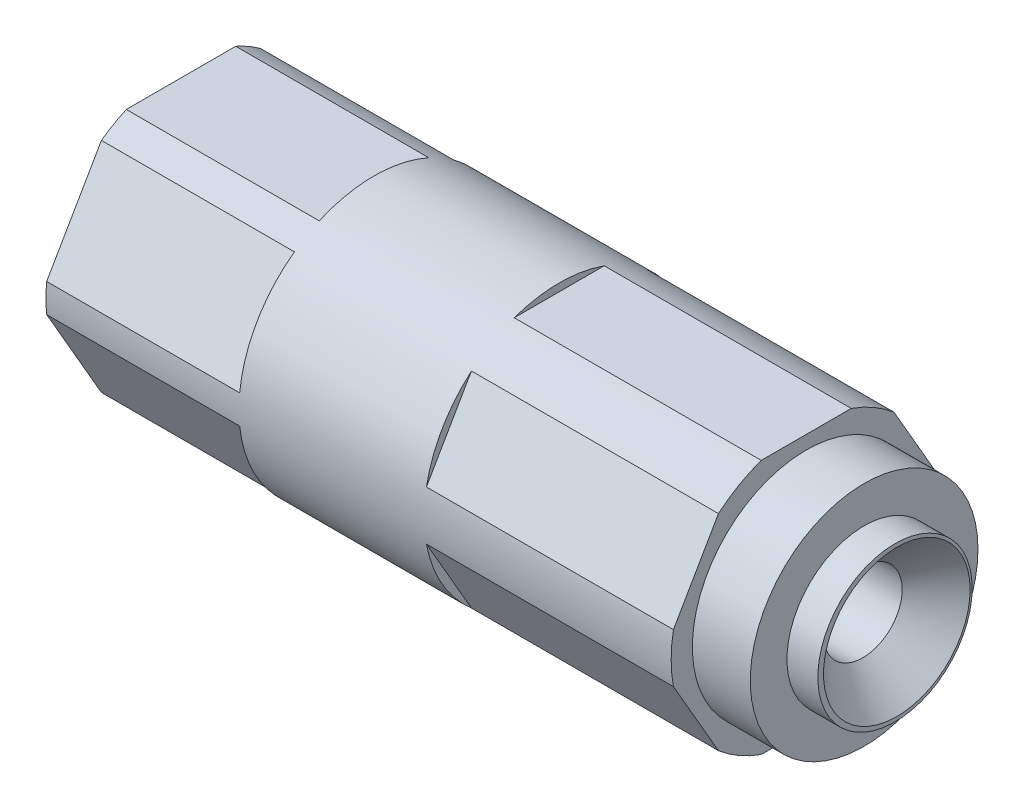
ISO-10303-21;
HEADER;
FILE_DESCRIPTION(('STEP AP214'),'2;1');
FILE_NAME('part.step','',(''),(''),'','','');
FILE_SCHEMA(('AUTOMOTIVE_DESIGN { 1 0 10303 214 1 1 1 1 }'));
ENDSEC;
DATA;
#1=APPLICATION_CONTEXT('core data for automotive mechanical design processes');
#2=APPLICATION_PROTOCOL_DEFINITION('international standard','automotive_design',2000,#1);
#3=PRODUCT_CONTEXT('',#1,'mechanical');
#4=PRODUCT('Part','Part','',(#3));
#5=PRODUCT_RELATED_PRODUCT_CATEGORY('part','',(#4));
#6=PRODUCT_DEFINITION_FORMATION('','',#4);
#7=PRODUCT_DEFINITION_CONTEXT('part definition',#1,'design');
#8=PRODUCT_DEFINITION('design','',#6,#7);
#9=PRODUCT_DEFINITION_SHAPE('','',#8);
#10=(LENGTH_UNIT() NAMED_UNIT(*) SI_UNIT(.MILLI.,.METRE.));
#11=(NAMED_UNIT(*) PLANE_ANGLE_UNIT() SI_UNIT($,.RADIAN.));
#12=(NAMED_UNIT(*) SI_UNIT($,.STERADIAN.) SOLID_ANGLE_UNIT());
#13=UNCERTAINTY_MEASURE_WITH_UNIT(LENGTH_MEASURE(1.E-05),#10,'distance_accuracy_value','');
#14=(GEOMETRIC_REPRESENTATION_CONTEXT(3) GLOBAL_UNCERTAINTY_ASSIGNED_CONTEXT((#13)) GLOBAL_UNIT_ASSIGNED_CONTEXT((#10,
#11,#12)) REPRESENTATION_CONTEXT('',''));
#15=CARTESIAN_POINT('',(0.,0.,0.));
#16=DIRECTION('',(0.,0.,1.));
#17=DIRECTION('',(1.,0.,0.));
#18=AXIS2_PLACEMENT_3D('',#15,#16,#17);
#19=CARTESIAN_POINT('',(0.,0.,0.));
#20=DIRECTION('',(1.,0.,0.));
#21=DIRECTION('',(0.,0.,-1.));
#22=AXIS2_PLACEMENT_3D('',#19,#20,#21);
#23=CYLINDRICAL_SURFACE('',#22,17.5);
#24=CARTESIAN_POINT('',(25.,0.,0.));
#25=DIRECTION('',(-1.,0.,0.));
#26=DIRECTION('',(0.,0.,1.));
#27=AXIS2_PLACEMENT_3D('',#24,#25,#26);
#28=CIRCLE('',#27,17.5);
#29=CARTESIAN_POINT('',(25.,14.1390145789043,10.3120447408616));
#30=VERTEX_POINT('',#29);
#31=CARTESIAN_POINT('',(25.,1.86098542109565,17.4007681802405));
#32=VERTEX_POINT('',#31);
#33=EDGE_CURVE('E337',#30,#32,#28,.F.);
#34=ORIENTED_EDGE('',*,*,#33,.T.);
#35=DIRECTION('',(1.,0.,0.));
#36=VECTOR('',#35,1.);
#37=CARTESIAN_POINT('',(0.,1.86098542109565,17.4007681802405));
#38=LINE('',#37,#36);
#39=CARTESIAN_POINT('',(0.,1.86098542109565,17.4007681802405));
#40=VERTEX_POINT('',#39);
#41=EDGE_CURVE('E371',#32,#40,#38,.F.);
#42=ORIENTED_EDGE('',*,*,#41,.T.);
#43=CARTESIAN_POINT('',(0.,0.,0.));
#44=DIRECTION('',(1.,0.,0.));
#45=DIRECTION('',(0.,0.,-1.));
#46=AXIS2_PLACEMENT_3D('',#43,#44,#45);
#47=CIRCLE('',#46,17.5);
#48=CARTESIAN_POINT('',(0.,-1.86098542109564,17.4007681802405));
#49=VERTEX_POINT('',#48);
#50=EDGE_CURVE('E518',#40,#49,#47,.T.);
#51=ORIENTED_EDGE('',*,*,#50,.T.);
#52=DIRECTION('',(1.,0.,0.));
#53=VECTOR('',#52,1.);
#54=CARTESIAN_POINT('',(0.,-1.86098542109565,17.4007681802405));
#55=LINE('',#54,#53);
#56=CARTESIAN_POINT('',(25.,-1.86098542109565,17.4007681802405));
#57=VERTEX_POINT('',#56);
#58=EDGE_CURVE('E361',#49,#57,#55,.T.);
#59=ORIENTED_EDGE('',*,*,#58,.T.);
#60=CARTESIAN_POINT('',(25.,-14.1390145789044,10.3120447408615));
#61=VERTEX_POINT('',#60);
#62=EDGE_CURVE('E364',#57,#61,#28,.F.);
#63=ORIENTED_EDGE('',*,*,#62,.T.);
#64=DIRECTION('',(1.,0.,0.));
#65=VECTOR('',#64,1.);
#66=CARTESIAN_POINT('',(0.,-14.1390145789044,10.3120447408615));
#67=LINE('',#66,#65);
#68=CARTESIAN_POINT('',(0.,-14.1390145789044,10.3120447408615));
#69=VERTEX_POINT('',#68);
#70=EDGE_CURVE('E365',#61,#69,#67,.F.);
#71=ORIENTED_EDGE('',*,*,#70,.T.);
#72=CARTESIAN_POINT('',(0.,-16.,7.08872343937892));
#73=VERTEX_POINT('',#72);
#74=EDGE_CURVE('E523',#69,#73,#47,.T.);
#75=ORIENTED_EDGE('',*,*,#74,.T.);
#76=DIRECTION('',(1.,0.,0.));
#77=VECTOR('',#76,1.);
#78=CARTESIAN_POINT('',(0.,-16.,7.08872343937892));
#79=LINE('',#78,#77);
#80=CARTESIAN_POINT('',(25.,-16.,7.08872343937892));
#81=VERTEX_POINT('',#80);
#82=EDGE_CURVE('E354',#73,#81,#79,.T.);
#83=ORIENTED_EDGE('',*,*,#82,.T.);
#84=CARTESIAN_POINT('',(25.,-16.,-7.08872343937893));
#85=VERTEX_POINT('',#84);
#86=EDGE_CURVE('E357',#81,#85,#28,.F.);
#87=ORIENTED_EDGE('',*,*,#86,.T.);
#88=DIRECTION('',(1.,0.,0.));
#89=VECTOR('',#88,1.);
#90=CARTESIAN_POINT('',(0.,-16.,-7.08872343937893));
#91=LINE('',#90,#89);
#92=CARTESIAN_POINT('',(0.,-16.,-7.08872343937893));
#93=VERTEX_POINT('',#92);
#94=EDGE_CURVE('E358',#85,#93,#91,.F.);
#95=ORIENTED_EDGE('',*,*,#94,.T.);
#96=CARTESIAN_POINT('',(0.,-14.1390145789043,-10.3120447408616));
#97=VERTEX_POINT('',#96);
#98=EDGE_CURVE('E328',#93,#97,#47,.T.);
#99=ORIENTED_EDGE('',*,*,#98,.T.);
#100=DIRECTION('',(1.,0.,0.));
#101=VECTOR('',#100,1.);
#102=CARTESIAN_POINT('',(0.,-14.1390145789043,-10.3120447408616));
#103=LINE('',#102,#101);
#104=CARTESIAN_POINT('',(25.,-14.1390145789043,-10.3120447408616));
#105=VERTEX_POINT('',#104);
#106=EDGE_CURVE('E347',#97,#105,#103,.T.);
#107=ORIENTED_EDGE('',*,*,#106,.T.);
#108=CARTESIAN_POINT('',(25.,-1.86098542109567,-17.4007681802405));
#109=VERTEX_POINT('',#108);
#110=EDGE_CURVE('E350',#105,#109,#28,.F.);
#111=ORIENTED_EDGE('',*,*,#110,.T.);
#112=DIRECTION('',(1.,0.,0.));
#113=VECTOR('',#112,1.);
#114=CARTESIAN_POINT('',(0.,-1.86098542109567,-17.4007681802405));
#115=LINE('',#114,#113);
#116=CARTESIAN_POINT('',(0.,-1.86098542109567,-17.4007681802405));
#117=VERTEX_POINT('',#116);
#118=EDGE_CURVE('E351',#109,#117,#115,.F.);
#119=ORIENTED_EDGE('',*,*,#118,.T.);
#120=CARTESIAN_POINT('',(0.,1.86098542109566,-17.4007681802405));
#121=VERTEX_POINT('',#120);
#122=EDGE_CURVE('E325',#117,#121,#47,.T.);
#123=ORIENTED_EDGE('',*,*,#122,.T.);
#124=DIRECTION('',(1.,0.,0.));
#125=VECTOR('',#124,1.);
#126=CARTESIAN_POINT('',(0.,1.86098542109566,-17.4007681802405));
#127=LINE('',#126,#125);
#128=CARTESIAN_POINT('',(25.,1.86098542109566,-17.4007681802405));
#129=VERTEX_POINT('',#128);
#130=EDGE_CURVE('E341',#121,#129,#127,.T.);
#131=ORIENTED_EDGE('',*,*,#130,.T.);
#132=CARTESIAN_POINT('',(25.,14.1390145789043,-10.3120447408616));
#133=VERTEX_POINT('',#132);
#134=EDGE_CURVE('E338',#129,#133,#28,.F.);
#135=ORIENTED_EDGE('',*,*,#134,.T.);
#136=DIRECTION('',(1.,0.,0.));
#137=VECTOR('',#136,1.);
#138=CARTESIAN_POINT('',(0.,14.1390145789043,-10.3120447408616));
#139=LINE('',#138,#137);
#140=CARTESIAN_POINT('',(0.,14.1390145789043,-10.3120447408616));
#141=VERTEX_POINT('',#140);
#142=EDGE_CURVE('E344',#133,#141,#139,.F.);
#143=ORIENTED_EDGE('',*,*,#142,.T.);
#144=CARTESIAN_POINT('',(0.,16.,-7.08872343937891));
#145=VERTEX_POINT('',#144);
#146=EDGE_CURVE('E329',#141,#145,#47,.T.);
#147=ORIENTED_EDGE('',*,*,#146,.T.);
#148=DIRECTION('',(1.,0.,0.));
#149=VECTOR('',#148,1.);
#150=CARTESIAN_POINT('',(0.,16.,-7.08872343937891));
#151=LINE('',#150,#149);
#152=CARTESIAN_POINT('',(25.,16.,-7.08872343937891));
#153=VERTEX_POINT('',#152);
#154=EDGE_CURVE('E330',#145,#153,#151,.T.);
#155=ORIENTED_EDGE('',*,*,#154,.T.);
#156=CARTESIAN_POINT('',(25.,16.,7.08872343937891));
#157=VERTEX_POINT('',#156);
#158=EDGE_CURVE('E333',#153,#157,#28,.F.);
#159=ORIENTED_EDGE('',*,*,#158,.T.);
#160=DIRECTION('',(1.,0.,0.));
#161=VECTOR('',#160,1.);
#162=CARTESIAN_POINT('',(0.,16.,7.08872343937891));
#163=LINE('',#162,#161);
#164=CARTESIAN_POINT('',(0.,16.,7.08872343937891));
#165=VERTEX_POINT('',#164);
#166=EDGE_CURVE('E336',#157,#165,#163,.F.);
#167=ORIENTED_EDGE('',*,*,#166,.T.);
#168=CARTESIAN_POINT('',(0.,14.1390145789043,10.3120447408616));
#169=VERTEX_POINT('',#168);
#170=EDGE_CURVE('E522',#165,#169,#47,.T.);
#171=ORIENTED_EDGE('',*,*,#170,.T.);
#172=DIRECTION('',(1.,0.,0.));
#173=VECTOR('',#172,1.);
#174=CARTESIAN_POINT('',(0.,14.1390145789043,10.3120447408616));
#175=LINE('',#174,#173);
#176=EDGE_CURVE('E368',#169,#30,#175,.T.);
#177=ORIENTED_EDGE('',*,*,#176,.T.);
#178=EDGE_LOOP('',(#34,#42,#51,#59,#63,#71,#75,#83,#87,#95,#99,#107,#111,#119,#123,#131,#135,
#143,#147,#155,#159,#167,#171,#177));
#179=FACE_BOUND('',#178,.T.);
#180=CARTESIAN_POINT('',(81.,0.,0.));
#181=DIRECTION('',(1.,0.,0.));
#182=DIRECTION('',(0.,0.,-1.));
#183=AXIS2_PLACEMENT_3D('',#180,#181,#182);
#184=CIRCLE('',#183,17.5);
#185=CARTESIAN_POINT('',(81.,-13.299752469181,11.3739432150206));
#186=VERTEX_POINT('',#185);
#187=CARTESIAN_POINT('',(81.,-16.5,5.8309518948453));
#188=VERTEX_POINT('',#187);
#189=EDGE_CURVE('E412',#186,#188,#184,.T.);
#190=ORIENTED_EDGE('',*,*,#189,.F.);
#191=DIRECTION('',(1.,0.,0.));
#192=VECTOR('',#191,1.);
#193=CARTESIAN_POINT('',(0.,-13.299752469181,11.3739432150206));
#194=LINE('',#193,#192);
#195=CARTESIAN_POINT('',(49.,-13.299752469181,11.3739432150206));
#196=VERTEX_POINT('',#195);
#197=EDGE_CURVE('E269',#186,#196,#194,.F.);
#198=ORIENTED_EDGE('',*,*,#197,.T.);
#199=CARTESIAN_POINT('',(49.,0.,0.));
#200=DIRECTION('',(1.,0.,0.));
#201=DIRECTION('',(0.,0.,-1.));
#202=AXIS2_PLACEMENT_3D('',#199,#200,#201);
#203=CIRCLE('',#202,17.5);
#204=CARTESIAN_POINT('',(49.,-3.20024753081897,17.2048951098659));
#205=VERTEX_POINT('',#204);
#206=EDGE_CURVE('E12',#196,#205,#203,.F.);
#207=ORIENTED_EDGE('',*,*,#206,.T.);
#208=DIRECTION('',(1.,0.,0.));
#209=VECTOR('',#208,1.);
#210=CARTESIAN_POINT('',(0.,-3.20024753081897,17.2048951098659));
#211=LINE('',#210,#209);
#212=CARTESIAN_POINT('',(81.,-3.20024753081895,17.2048951098659));
#213=VERTEX_POINT('',#212);
#214=EDGE_CURVE('E266',#205,#213,#211,.T.);
#215=ORIENTED_EDGE('',*,*,#214,.T.);
#216=CARTESIAN_POINT('',(81.,3.20024753081898,17.2048951098659));
#217=VERTEX_POINT('',#216);
#218=EDGE_CURVE('E410',#217,#213,#184,.T.);
#219=ORIENTED_EDGE('',*,*,#218,.F.);
#220=DIRECTION('',(1.,0.,0.));
#221=VECTOR('',#220,1.);
#222=CARTESIAN_POINT('',(0.,3.20024753081897,17.2048951098659));
#223=LINE('',#222,#221);
#224=CARTESIAN_POINT('',(49.,3.20024753081898,17.2048951098659));
#225=VERTEX_POINT('',#224);
#226=EDGE_CURVE('E263',#217,#225,#223,.F.);
#227=ORIENTED_EDGE('',*,*,#226,.T.);
#228=CARTESIAN_POINT('',(49.,13.299752469181,11.3739432150206));
#229=VERTEX_POINT('',#228);
#230=EDGE_CURVE('E48',#225,#229,#203,.F.);
#231=ORIENTED_EDGE('',*,*,#230,.T.);
#232=DIRECTION('',(1.,0.,0.));
#233=VECTOR('',#232,1.);
#234=CARTESIAN_POINT('',(0.,13.299752469181,11.3739432150206));
#235=LINE('',#234,#233);
#236=CARTESIAN_POINT('',(81.,13.299752469181,11.3739432150206));
#237=VERTEX_POINT('',#236);
#238=EDGE_CURVE('E260',#229,#237,#235,.T.);
#239=ORIENTED_EDGE('',*,*,#238,.T.);
#240=CARTESIAN_POINT('',(81.,16.5,5.8309518948453));
#241=VERTEX_POINT('',#240);
#242=EDGE_CURVE('E411',#241,#237,#184,.T.);
#243=ORIENTED_EDGE('',*,*,#242,.F.);
#244=DIRECTION('',(1.,0.,0.));
#245=VECTOR('',#244,1.);
#246=CARTESIAN_POINT('',(0.,16.5,5.83095189484529));
#247=LINE('',#246,#245);
#248=CARTESIAN_POINT('',(49.,16.5,5.83095189484529));
#249=VERTEX_POINT('',#248);
#250=EDGE_CURVE('E257',#241,#249,#247,.F.);
#251=ORIENTED_EDGE('',*,*,#250,.T.);
#252=CARTESIAN_POINT('',(49.,16.5,-5.8309518948453));
#253=VERTEX_POINT('',#252);
#254=EDGE_CURVE('E398',#249,#253,#203,.F.);
#255=ORIENTED_EDGE('',*,*,#254,.T.);
#256=DIRECTION('',(1.,0.,0.));
#257=VECTOR('',#256,1.);
#258=CARTESIAN_POINT('',(0.,16.5,-5.8309518948453));
#259=LINE('',#258,#257);
#260=CARTESIAN_POINT('',(81.,16.5,-5.8309518948453));
#261=VERTEX_POINT('',#260);
#262=EDGE_CURVE('E254',#253,#261,#259,.T.);
#263=ORIENTED_EDGE('',*,*,#262,.T.);
#264=CARTESIAN_POINT('',(81.,13.299752469181,-11.3739432150206));
#265=VERTEX_POINT('',#264);
#266=EDGE_CURVE('E324',#265,#261,#184,.T.);
#267=ORIENTED_EDGE('',*,*,#266,.F.);
#268=DIRECTION('',(1.,0.,0.));
#269=VECTOR('',#268,1.);
#270=CARTESIAN_POINT('',(0.,13.299752469181,-11.3739432150206));
#271=LINE('',#270,#269);
#272=CARTESIAN_POINT('',(49.,13.299752469181,-11.3739432150206));
#273=VERTEX_POINT('',#272);
#274=EDGE_CURVE('E251',#265,#273,#271,.F.);
#275=ORIENTED_EDGE('',*,*,#274,.T.);
#276=CARTESIAN_POINT('',(49.,3.20024753081896,-17.2048951098659));
#277=VERTEX_POINT('',#276);
#278=EDGE_CURVE('E396',#273,#277,#203,.F.);
#279=ORIENTED_EDGE('',*,*,#278,.T.);
#280=DIRECTION('',(1.,0.,0.));
#281=VECTOR('',#280,1.);
#282=CARTESIAN_POINT('',(0.,3.20024753081896,-17.2048951098659));
#283=LINE('',#282,#281);
#284=CARTESIAN_POINT('',(81.,3.20024753081896,-17.2048951098659));
#285=VERTEX_POINT('',#284);
#286=EDGE_CURVE('E248',#277,#285,#283,.T.);
#287=ORIENTED_EDGE('',*,*,#286,.T.);
#288=CARTESIAN_POINT('',(81.,-3.20024753081898,-17.2048951098659));
#289=VERTEX_POINT('',#288);
#290=EDGE_CURVE('E320',#289,#285,#184,.T.);
#291=ORIENTED_EDGE('',*,*,#290,.F.);
#292=DIRECTION('',(1.,0.,0.));
#293=VECTOR('',#292,1.);
#294=CARTESIAN_POINT('',(0.,-3.20024753081896,-17.2048951098659));
#295=LINE('',#294,#293);
#296=CARTESIAN_POINT('',(49.,-3.20024753081896,-17.2048951098659));
#297=VERTEX_POINT('',#296);
#298=EDGE_CURVE('E55',#289,#297,#295,.F.);
#299=ORIENTED_EDGE('',*,*,#298,.T.);
#300=CARTESIAN_POINT('',(49.,-13.299752469181,-11.3739432150206));
#301=VERTEX_POINT('',#300);
#302=EDGE_CURVE('E393',#297,#301,#203,.F.);
#303=ORIENTED_EDGE('',*,*,#302,.T.);
#304=DIRECTION('',(1.,0.,0.));
#305=VECTOR('',#304,1.);
#306=CARTESIAN_POINT('',(0.,-13.299752469181,-11.3739432150206));
#307=LINE('',#306,#305);
#308=CARTESIAN_POINT('',(81.,-13.299752469181,-11.3739432150206));
#309=VERTEX_POINT('',#308);
#310=EDGE_CURVE('E244',#301,#309,#307,.T.);
#311=ORIENTED_EDGE('',*,*,#310,.T.);
#312=CARTESIAN_POINT('',(81.,-16.5,-5.8309518948453));
#313=VERTEX_POINT('',#312);
#314=EDGE_CURVE('E323',#313,#309,#184,.T.);
#315=ORIENTED_EDGE('',*,*,#314,.F.);
#316=DIRECTION('',(1.,0.,0.));
#317=VECTOR('',#316,1.);
#318=CARTESIAN_POINT('',(0.,-16.5,-5.83095189484531));
#319=LINE('',#318,#317);
#320=CARTESIAN_POINT('',(49.,-16.5,-5.83095189484531));
#321=VERTEX_POINT('',#320);
#322=EDGE_CURVE('E63',#313,#321,#319,.F.);
#323=ORIENTED_EDGE('',*,*,#322,.T.);
#324=CARTESIAN_POINT('',(49.,-16.5,5.83095189484531));
#325=VERTEX_POINT('',#324);
#326=EDGE_CURVE('E43',#321,#325,#203,.F.);
#327=ORIENTED_EDGE('',*,*,#326,.T.);
#328=DIRECTION('',(1.,0.,0.));
#329=VECTOR('',#328,1.);
#330=CARTESIAN_POINT('',(0.,-16.5,5.83095189484531));
#331=LINE('',#330,#329);
#332=EDGE_CURVE('E240',#325,#188,#331,.T.);
#333=ORIENTED_EDGE('',*,*,#332,.T.);
#334=EDGE_LOOP('',(#190,#198,#207,#215,#219,#227,#231,#239,#243,#251,#255,#263,#267,#275,#279,
#287,#291,#299,#303,#311,#315,#323,#327,#333));
#335=FACE_BOUND('',#334,.T.);
#336=ADVANCED_FACE('F39',(#179,#335),#23,.T.);
#337=CARTESIAN_POINT('',(81.,17.5,0.));
#338=DIRECTION('',(1.,0.,0.));
#339=DIRECTION('',(0.,0.,-1.));
#340=AXIS2_PLACEMENT_3D('',#337,#338,#339);
#341=PLANE('',#340);
#342=CARTESIAN_POINT('',(81.,0.,0.));
#343=DIRECTION('',(1.,0.,0.));
#344=DIRECTION('',(0.,0.,-1.));
#345=AXIS2_PLACEMENT_3D('',#342,#343,#344);
#346=CIRCLE('',#345,14.75);
#347=CARTESIAN_POINT('',(81.,0.,-14.75));
#348=VERTEX_POINT('',#347);
#349=EDGE_CURVE('E317',#348,#348,#346,.T.);
#350=ORIENTED_EDGE('',*,*,#349,.F.);
#351=EDGE_LOOP('',(#350));
#352=FACE_BOUND('',#351,.T.);
#353=ORIENTED_EDGE('',*,*,#218,.T.);
#354=DIRECTION('',(0.,-0.866025403784439,-0.5));
#355=VECTOR('',#354,1.);
#356=CARTESIAN_POINT('',(81.,4.87500000000001,21.8671414455571));
#357=LINE('',#356,#355);
#358=EDGE_CURVE('E386',#213,#186,#357,.T.);
#359=ORIENTED_EDGE('',*,*,#358,.T.);
#360=ORIENTED_EDGE('',*,*,#189,.T.);
#361=DIRECTION('',(0.,0.,-1.));
#362=VECTOR('',#361,1.);
#363=CARTESIAN_POINT('',(81.,-16.5,0.));
#364=LINE('',#363,#362);
#365=EDGE_CURVE('E374',#188,#313,#364,.T.);
#366=ORIENTED_EDGE('',*,*,#365,.T.);
#367=ORIENTED_EDGE('',*,*,#314,.T.);
#368=DIRECTION('',(0.,0.866025403784439,-0.5));
#369=VECTOR('',#368,1.);
#370=CARTESIAN_POINT('',(81.,4.875,-21.8671414455571));
#371=LINE('',#370,#369);
#372=EDGE_CURVE('E376',#309,#289,#371,.T.);
#373=ORIENTED_EDGE('',*,*,#372,.T.);
#374=ORIENTED_EDGE('',*,*,#290,.T.);
#375=DIRECTION('',(0.,0.866025403784439,0.5));
#376=VECTOR('',#375,1.);
#377=CARTESIAN_POINT('',(81.,21.375,-6.71169687932941));
#378=LINE('',#377,#376);
#379=EDGE_CURVE('E378',#285,#265,#378,.T.);
#380=ORIENTED_EDGE('',*,*,#379,.T.);
#381=ORIENTED_EDGE('',*,*,#266,.T.);
#382=DIRECTION('',(0.,0.,1.));
#383=VECTOR('',#382,1.);
#384=CARTESIAN_POINT('',(81.,16.5,0.));
#385=LINE('',#384,#383);
#386=EDGE_CURVE('E381',#261,#241,#385,.T.);
#387=ORIENTED_EDGE('',*,*,#386,.T.);
#388=ORIENTED_EDGE('',*,*,#242,.T.);
#389=DIRECTION('',(0.,-0.866025403784439,0.5));
#390=VECTOR('',#389,1.);
#391=CARTESIAN_POINT('',(81.,21.375,6.7116968793294));
#392=LINE('',#391,#390);
#393=EDGE_CURVE('E384',#237,#217,#392,.T.);
#394=ORIENTED_EDGE('',*,*,#393,.T.);
#395=EDGE_LOOP('',(#353,#359,#360,#366,#367,#373,#374,#380,#381,#387,#388,#394));
#396=FACE_BOUND('',#395,.T.);
#397=ADVANCED_FACE('F409',(#352,#396),#341,.T.);
#398=CARTESIAN_POINT('',(0.,0.,0.));
#399=DIRECTION('',(-1.,0.,0.));
#400=DIRECTION('',(0.,0.,1.));
#401=AXIS2_PLACEMENT_3D('',#398,#399,#400);
#402=PLANE('',#401);
#403=CARTESIAN_POINT('',(0.,0.,0.));
#404=DIRECTION('',(-1.,0.,0.));
#405=DIRECTION('',(0.,0.,1.));
#406=AXIS2_PLACEMENT_3D('',#403,#404,#405);
#407=CIRCLE('',#406,4.25);
#408=CARTESIAN_POINT('',(0.,0.,4.25));
#409=VERTEX_POINT('',#408);
#410=EDGE_CURVE('E272',#409,#409,#407,.T.);
#411=ORIENTED_EDGE('',*,*,#410,.F.);
#412=EDGE_LOOP('',(#411));
#413=FACE_BOUND('',#412,.T.);
#414=ORIENTED_EDGE('',*,*,#50,.F.);
#415=DIRECTION('',(0.,0.866025403784439,-0.5));
#416=VECTOR('',#415,1.);
#417=CARTESIAN_POINT('',(0.,0.,18.475208614068));
#418=LINE('',#417,#416);
#419=EDGE_CURVE('E278',#40,#169,#418,.T.);
#420=ORIENTED_EDGE('',*,*,#419,.T.);
#421=ORIENTED_EDGE('',*,*,#170,.F.);
#422=DIRECTION('',(0.,0.,-1.));
#423=VECTOR('',#422,1.);
#424=CARTESIAN_POINT('',(0.,16.,9.23760430703401));
#425=LINE('',#424,#423);
#426=EDGE_CURVE('E295',#165,#145,#425,.T.);
#427=ORIENTED_EDGE('',*,*,#426,.T.);
#428=ORIENTED_EDGE('',*,*,#146,.F.);
#429=DIRECTION('',(0.,-0.866025403784439,-0.5));
#430=VECTOR('',#429,1.);
#431=CARTESIAN_POINT('',(0.,16.,-9.23760430703401));
#432=LINE('',#431,#430);
#433=EDGE_CURVE('E298',#141,#121,#432,.T.);
#434=ORIENTED_EDGE('',*,*,#433,.T.);
#435=ORIENTED_EDGE('',*,*,#122,.F.);
#436=DIRECTION('',(0.,-0.866025403784439,0.5));
#437=VECTOR('',#436,1.);
#438=CARTESIAN_POINT('',(0.,0.,-18.475208614068));
#439=LINE('',#438,#437);
#440=EDGE_CURVE('E301',#117,#97,#439,.T.);
#441=ORIENTED_EDGE('',*,*,#440,.T.);
#442=ORIENTED_EDGE('',*,*,#98,.F.);
#443=DIRECTION('',(0.,0.,1.));
#444=VECTOR('',#443,1.);
#445=CARTESIAN_POINT('',(0.,-16.,-9.23760430703402));
#446=LINE('',#445,#444);
#447=EDGE_CURVE('E304',#93,#73,#446,.T.);
#448=ORIENTED_EDGE('',*,*,#447,.T.);
#449=ORIENTED_EDGE('',*,*,#74,.F.);
#450=DIRECTION('',(0.,0.866025403784439,0.5));
#451=VECTOR('',#450,1.);
#452=CARTESIAN_POINT('',(0.,-16.,9.237604307034));
#453=LINE('',#452,#451);
#454=EDGE_CURVE('E282',#69,#49,#453,.T.);
#455=ORIENTED_EDGE('',*,*,#454,.T.);
#456=EDGE_LOOP('',(#414,#420,#421,#427,#428,#434,#435,#441,#442,#448,#449,#455));
#457=FACE_BOUND('',#456,.T.);
#458=ADVANCED_FACE('F41',(#413,#457),#402,.T.);
#459=CARTESIAN_POINT('',(0.,0.,0.));
#460=DIRECTION('',(1.,0.,0.));
#461=DIRECTION('',(0.,0.,-1.));
#462=AXIS2_PLACEMENT_3D('',#459,#460,#461);
#463=CYLINDRICAL_SURFACE('',#462,14.75);
#464=ORIENTED_EDGE('',*,*,#349,.T.);
#465=EDGE_LOOP('',(#464));
#466=FACE_BOUND('',#465,.T.);
#467=CARTESIAN_POINT('',(88.5,0.,0.));
#468=DIRECTION('',(1.,0.,0.));
#469=DIRECTION('',(0.,0.,-1.));
#470=AXIS2_PLACEMENT_3D('',#467,#468,#469);
#471=CIRCLE('',#470,14.75);
#472=CARTESIAN_POINT('',(88.5,0.,-14.75));
#473=VERTEX_POINT('',#472);
#474=EDGE_CURVE('E314',#473,#473,#471,.T.);
#475=ORIENTED_EDGE('',*,*,#474,.F.);
#476=EDGE_LOOP('',(#475));
#477=FACE_BOUND('',#476,.T.);
#478=ADVANCED_FACE('F451',(#466,#477),#463,.T.);
#479=CARTESIAN_POINT('',(88.5,14.75,0.));
#480=DIRECTION('',(1.,0.,0.));
#481=DIRECTION('',(0.,0.,-1.));
#482=AXIS2_PLACEMENT_3D('',#479,#480,#481);
#483=PLANE('',#482);
#484=ORIENTED_EDGE('',*,*,#474,.T.);
#485=EDGE_LOOP('',(#484));
#486=FACE_BOUND('',#485,.T.);
#487=CARTESIAN_POINT('',(88.5,0.,0.));
#488=DIRECTION('',(1.,0.,0.));
#489=DIRECTION('',(0.,0.,-1.));
#490=AXIS2_PLACEMENT_3D('',#487,#488,#489);
#491=CIRCLE('',#490,10.);
#492=CARTESIAN_POINT('',(88.5,0.,-10.));
#493=VERTEX_POINT('',#492);
#494=EDGE_CURVE('E311',#493,#493,#491,.T.);
#495=ORIENTED_EDGE('',*,*,#494,.F.);
#496=EDGE_LOOP('',(#495));
#497=FACE_BOUND('',#496,.T.);
#498=ADVANCED_FACE('F454',(#486,#497),#483,.T.);
#499=CARTESIAN_POINT('',(0.,0.,0.));
#500=DIRECTION('',(1.,0.,0.));
#501=DIRECTION('',(0.,0.,-1.));
#502=AXIS2_PLACEMENT_3D('',#499,#500,#501);
#503=CYLINDRICAL_SURFACE('',#502,10.);
#504=ORIENTED_EDGE('',*,*,#494,.T.);
#505=EDGE_LOOP('',(#504));
#506=FACE_BOUND('',#505,.T.);
#507=CARTESIAN_POINT('',(92.5,0.,0.));
#508=DIRECTION('',(1.,0.,0.));
#509=DIRECTION('',(0.,0.,-1.));
#510=AXIS2_PLACEMENT_3D('',#507,#508,#509);
#511=CIRCLE('',#510,10.);
#512=CARTESIAN_POINT('',(92.5,0.,-10.));
#513=VERTEX_POINT('',#512);
#514=EDGE_CURVE('E292',#513,#513,#511,.T.);
#515=ORIENTED_EDGE('',*,*,#514,.F.);
#516=EDGE_LOOP('',(#515));
#517=FACE_BOUND('',#516,.T.);
#518=ADVANCED_FACE('F458',(#506,#517),#503,.T.);
#519=CARTESIAN_POINT('',(92.5,10.,0.));
#520=DIRECTION('',(1.,0.,0.));
#521=DIRECTION('',(0.,0.,-1.));
#522=AXIS2_PLACEMENT_3D('',#519,#520,#521);
#523=PLANE('',#522);
#524=CARTESIAN_POINT('',(92.5,-0.0250363622740224,-0.231792894879845));
#525=DIRECTION('',(1.,0.,0.));
#526=DIRECTION('',(0.,0.,-1.));
#527=AXIS2_PLACEMENT_3D('',#524,#525,#526);
#528=CIRCLE('',#527,9.5);
#529=CARTESIAN_POINT('',(92.5,-0.0250363622740224,-9.73179289487985));
#530=VERTEX_POINT('',#529);
#531=EDGE_CURVE('E224',#530,#530,#528,.T.);
#532=ORIENTED_EDGE('',*,*,#531,.F.);
#533=EDGE_LOOP('',(#532));
#534=FACE_BOUND('',#533,.T.);
#535=ORIENTED_EDGE('',*,*,#514,.T.);
#536=EDGE_LOOP('',(#535));
#537=FACE_BOUND('',#536,.T.);
#538=ADVANCED_FACE('F462',(#534,#537),#523,.T.);
#539=CARTESIAN_POINT('',(25.,16.,9.23760430703401));
#540=DIRECTION('',(0.,1.,0.));
#541=DIRECTION('',(0.,0.,1.));
#542=AXIS2_PLACEMENT_3D('',#539,#540,#541);
#543=PLANE('',#542);
#544=DIRECTION('',(0.,0.,-1.));
#545=VECTOR('',#544,1.);
#546=CARTESIAN_POINT('',(25.,16.,9.23760430703401));
#547=LINE('',#546,#545);
#548=EDGE_CURVE('E281',#157,#153,#547,.T.);
#549=ORIENTED_EDGE('',*,*,#548,.T.);
#550=ORIENTED_EDGE('',*,*,#154,.F.);
#551=ORIENTED_EDGE('',*,*,#426,.F.);
#552=ORIENTED_EDGE('',*,*,#166,.F.);
#553=EDGE_LOOP('',(#549,#550,#551,#552));
#554=FACE_BOUND('',#553,.T.);
#555=ADVANCED_FACE('F466',(#554),#543,.T.);
#556=CARTESIAN_POINT('',(25.,0.,0.));
#557=DIRECTION('',(-1.,0.,0.));
#558=DIRECTION('',(0.,0.,1.));
#559=AXIS2_PLACEMENT_3D('',#556,#557,#558);
#560=PLANE('',#559);
#561=ORIENTED_EDGE('',*,*,#548,.F.);
#562=ORIENTED_EDGE('',*,*,#158,.F.);
#563=EDGE_LOOP('',(#561,#562));
#564=FACE_BOUND('',#563,.T.);
#565=ADVANCED_FACE('F474',(#564),#560,.T.);
#566=CARTESIAN_POINT('',(25.,16.,-9.23760430703401));
#567=DIRECTION('',(0.,0.5,-0.866025403784439));
#568=DIRECTION('',(0.,0.866025403784439,0.5));
#569=AXIS2_PLACEMENT_3D('',#566,#567,#568);
#570=PLANE('',#569);
#571=DIRECTION('',(0.,-0.866025403784439,-0.5));
#572=VECTOR('',#571,1.);
#573=CARTESIAN_POINT('',(25.,16.,-9.23760430703401));
#574=LINE('',#573,#572);
#575=EDGE_CURVE('E284',#133,#129,#574,.T.);
#576=ORIENTED_EDGE('',*,*,#575,.T.);
#577=ORIENTED_EDGE('',*,*,#130,.F.);
#578=ORIENTED_EDGE('',*,*,#433,.F.);
#579=ORIENTED_EDGE('',*,*,#142,.F.);
#580=EDGE_LOOP('',(#576,#577,#578,#579));
#581=FACE_BOUND('',#580,.T.);
#582=ADVANCED_FACE('F482',(#581),#570,.T.);
#583=ORIENTED_EDGE('',*,*,#575,.F.);
#584=ORIENTED_EDGE('',*,*,#134,.F.);
#585=EDGE_LOOP('',(#583,#584));
#586=FACE_BOUND('',#585,.T.);
#587=ADVANCED_FACE('F485',(#586),#560,.T.);
#588=CARTESIAN_POINT('',(25.,0.,-18.475208614068));
#589=DIRECTION('',(0.,-0.5,-0.866025403784439));
#590=DIRECTION('',(0.,0.866025403784439,-0.5));
#591=AXIS2_PLACEMENT_3D('',#588,#589,#590);
#592=PLANE('',#591);
#593=DIRECTION('',(0.,-0.866025403784439,0.5));
#594=VECTOR('',#593,1.);
#595=CARTESIAN_POINT('',(25.,0.,-18.475208614068));
#596=LINE('',#595,#594);
#597=EDGE_CURVE('E286',#109,#105,#596,.T.);
#598=ORIENTED_EDGE('',*,*,#597,.T.);
#599=ORIENTED_EDGE('',*,*,#106,.F.);
#600=ORIENTED_EDGE('',*,*,#440,.F.);
#601=ORIENTED_EDGE('',*,*,#118,.F.);
#602=EDGE_LOOP('',(#598,#599,#600,#601));
#603=FACE_BOUND('',#602,.T.);
#604=ADVANCED_FACE('F487',(#603),#592,.T.);
#605=ORIENTED_EDGE('',*,*,#597,.F.);
#606=ORIENTED_EDGE('',*,*,#110,.F.);
#607=EDGE_LOOP('',(#605,#606));
#608=FACE_BOUND('',#607,.T.);
#609=ADVANCED_FACE('F490',(#608),#560,.T.);
#610=CARTESIAN_POINT('',(25.,-16.,-9.23760430703402));
#611=DIRECTION('',(0.,-1.,0.));
#612=DIRECTION('',(0.,0.,-1.));
#613=AXIS2_PLACEMENT_3D('',#610,#611,#612);
#614=PLANE('',#613);
#615=DIRECTION('',(0.,0.,1.));
#616=VECTOR('',#615,1.);
#617=CARTESIAN_POINT('',(25.,-16.,-9.23760430703402));
#618=LINE('',#617,#616);
#619=EDGE_CURVE('E288',#85,#81,#618,.T.);
#620=ORIENTED_EDGE('',*,*,#619,.T.);
#621=ORIENTED_EDGE('',*,*,#82,.F.);
#622=ORIENTED_EDGE('',*,*,#447,.F.);
#623=ORIENTED_EDGE('',*,*,#94,.F.);
#624=EDGE_LOOP('',(#620,#621,#622,#623));
#625=FACE_BOUND('',#624,.T.);
#626=ADVANCED_FACE('F492',(#625),#614,.T.);
#627=ORIENTED_EDGE('',*,*,#619,.F.);
#628=ORIENTED_EDGE('',*,*,#86,.F.);
#629=EDGE_LOOP('',(#627,#628));
#630=FACE_BOUND('',#629,.T.);
#631=ADVANCED_FACE('F495',(#630),#560,.T.);
#632=CARTESIAN_POINT('',(25.,-16.,9.237604307034));
#633=DIRECTION('',(0.,-0.5,0.866025403784438));
#634=DIRECTION('',(0.,-0.866025403784438,-0.5));
#635=AXIS2_PLACEMENT_3D('',#632,#633,#634);
#636=PLANE('',#635);
#637=DIRECTION('',(0.,0.866025403784439,0.5));
#638=VECTOR('',#637,1.);
#639=CARTESIAN_POINT('',(25.,-16.,9.237604307034));
#640=LINE('',#639,#638);
#641=EDGE_CURVE('E290',#61,#57,#640,.T.);
#642=ORIENTED_EDGE('',*,*,#641,.T.);
#643=ORIENTED_EDGE('',*,*,#58,.F.);
#644=ORIENTED_EDGE('',*,*,#454,.F.);
#645=ORIENTED_EDGE('',*,*,#70,.F.);
#646=EDGE_LOOP('',(#642,#643,#644,#645));
#647=FACE_BOUND('',#646,.T.);
#648=ADVANCED_FACE('F497',(#647),#636,.T.);
#649=ORIENTED_EDGE('',*,*,#641,.F.);
#650=ORIENTED_EDGE('',*,*,#62,.F.);
#651=EDGE_LOOP('',(#649,#650));
#652=FACE_BOUND('',#651,.T.);
#653=ADVANCED_FACE('F472',(#652),#560,.T.);
#654=DIRECTION('',(0.,0.866025403784439,-0.5));
#655=VECTOR('',#654,1.);
#656=CARTESIAN_POINT('',(25.,0.,18.475208614068));
#657=LINE('',#656,#655);
#658=EDGE_CURVE('E279',#32,#30,#657,.T.);
#659=ORIENTED_EDGE('',*,*,#658,.F.);
#660=ORIENTED_EDGE('',*,*,#33,.F.);
#661=EDGE_LOOP('',(#659,#660));
#662=FACE_BOUND('',#661,.T.);
#663=ADVANCED_FACE('F468',(#662),#560,.T.);
#664=CARTESIAN_POINT('',(25.,0.,18.475208614068));
#665=DIRECTION('',(0.,0.5,0.866025403784439));
#666=DIRECTION('',(0.,-0.866025403784439,0.5));
#667=AXIS2_PLACEMENT_3D('',#664,#665,#666);
#668=PLANE('',#667);
#669=ORIENTED_EDGE('',*,*,#658,.T.);
#670=ORIENTED_EDGE('',*,*,#176,.F.);
#671=ORIENTED_EDGE('',*,*,#419,.F.);
#672=ORIENTED_EDGE('',*,*,#41,.F.);
#673=EDGE_LOOP('',(#669,#670,#671,#672));
#674=FACE_BOUND('',#673,.T.);
#675=ADVANCED_FACE('F471',(#674),#668,.T.);
#676=CARTESIAN_POINT('',(24.5,0.,0.));
#677=DIRECTION('',(-1.,0.,0.));
#678=DIRECTION('',(0.,0.,1.));
#679=AXIS2_PLACEMENT_3D('',#676,#677,#678);
#680=CONICAL_SURFACE('',#679,4.24999999999999,1.02974425867665);
#681=CARTESIAN_POINT('',(27.0536576308671,0.,0.));
#682=VERTEX_POINT('',#681);
#683=VERTEX_LOOP('',#682);
#684=FACE_BOUND('',#683,.T.);
#685=CARTESIAN_POINT('',(24.5,0.,0.));
#686=DIRECTION('',(-1.,0.,0.));
#687=DIRECTION('',(0.,0.,1.));
#688=AXIS2_PLACEMENT_3D('',#685,#686,#687);
#689=CIRCLE('',#688,4.24999999999999);
#690=CARTESIAN_POINT('',(24.5,0.,4.24999999999999));
#691=VERTEX_POINT('',#690);
#692=EDGE_CURVE('E275',#691,#691,#689,.T.);
#693=ORIENTED_EDGE('',*,*,#692,.T.);
#694=EDGE_LOOP('',(#693));
#695=FACE_BOUND('',#694,.T.);
#696=ADVANCED_FACE('F477',(#684,#695),#680,.F.);
#697=CARTESIAN_POINT('',(0.,0.,0.));
#698=DIRECTION('',(-1.,0.,0.));
#699=DIRECTION('',(0.,0.,1.));
#700=AXIS2_PLACEMENT_3D('',#697,#698,#699);
#701=CYLINDRICAL_SURFACE('',#700,4.25);
#702=ORIENTED_EDGE('',*,*,#692,.F.);
#703=EDGE_LOOP('',(#702));
#704=FACE_BOUND('',#703,.T.);
#705=ORIENTED_EDGE('',*,*,#410,.T.);
#706=EDGE_LOOP('',(#705));
#707=FACE_BOUND('',#706,.T.);
#708=ADVANCED_FACE('F502',(#704,#707),#701,.F.);
#709=CARTESIAN_POINT('',(49.,-16.5,9.52627944162883));
#710=DIRECTION('',(0.,-1.,0.));
#711=DIRECTION('',(0.,0.,-1.));
#712=AXIS2_PLACEMENT_3D('',#709,#710,#711);
#713=PLANE('',#712);
#714=ORIENTED_EDGE('',*,*,#365,.F.);
#715=ORIENTED_EDGE('',*,*,#332,.F.);
#716=DIRECTION('',(0.,0.,-1.));
#717=VECTOR('',#716,1.);
#718=CARTESIAN_POINT('',(49.,-16.5,9.52627944162883));
#719=LINE('',#718,#717);
#720=EDGE_CURVE('E221',#325,#321,#719,.T.);
#721=ORIENTED_EDGE('',*,*,#720,.T.);
#722=ORIENTED_EDGE('',*,*,#322,.F.);
#723=EDGE_LOOP('',(#714,#715,#721,#722));
#724=FACE_BOUND('',#723,.T.);
#725=ADVANCED_FACE('F435',(#724),#713,.T.);
#726=CARTESIAN_POINT('',(49.,0.,0.));
#727=DIRECTION('',(1.,0.,0.));
#728=DIRECTION('',(0.,0.,-1.));
#729=AXIS2_PLACEMENT_3D('',#726,#727,#728);
#730=PLANE('',#729);
#731=ORIENTED_EDGE('',*,*,#720,.F.);
#732=ORIENTED_EDGE('',*,*,#326,.F.);
#733=EDGE_LOOP('',(#731,#732));
#734=FACE_BOUND('',#733,.T.);
#735=ADVANCED_FACE('F423',(#734),#730,.T.);
#736=CARTESIAN_POINT('',(49.,-16.5,-9.52627944162883));
#737=DIRECTION('',(0.,-0.5,-0.866025403784439));
#738=DIRECTION('',(0.,0.866025403784439,-0.5));
#739=AXIS2_PLACEMENT_3D('',#736,#737,#738);
#740=PLANE('',#739);
#741=ORIENTED_EDGE('',*,*,#372,.F.);
#742=ORIENTED_EDGE('',*,*,#310,.F.);
#743=DIRECTION('',(0.,0.866025403784439,-0.5));
#744=VECTOR('',#743,1.);
#745=CARTESIAN_POINT('',(49.,-16.5,-9.52627944162883));
#746=LINE('',#745,#744);
#747=EDGE_CURVE('E229',#301,#297,#746,.T.);
#748=ORIENTED_EDGE('',*,*,#747,.T.);
#749=ORIENTED_EDGE('',*,*,#298,.F.);
#750=EDGE_LOOP('',(#741,#742,#748,#749));
#751=FACE_BOUND('',#750,.T.);
#752=ADVANCED_FACE('F417',(#751),#740,.T.);
#753=ORIENTED_EDGE('',*,*,#747,.F.);
#754=ORIENTED_EDGE('',*,*,#302,.F.);
#755=EDGE_LOOP('',(#753,#754));
#756=FACE_BOUND('',#755,.T.);
#757=ADVANCED_FACE('F419',(#756),#730,.T.);
#758=CARTESIAN_POINT('',(49.,0.,-19.0525588832577));
#759=DIRECTION('',(0.,0.5,-0.866025403784439));
#760=DIRECTION('',(0.,0.866025403784439,0.5));
#761=AXIS2_PLACEMENT_3D('',#758,#759,#760);
#762=PLANE('',#761);
#763=ORIENTED_EDGE('',*,*,#379,.F.);
#764=ORIENTED_EDGE('',*,*,#286,.F.);
#765=DIRECTION('',(0.,0.866025403784439,0.5));
#766=VECTOR('',#765,1.);
#767=CARTESIAN_POINT('',(49.,0.,-19.0525588832577));
#768=LINE('',#767,#766);
#769=EDGE_CURVE('E231',#277,#273,#768,.T.);
#770=ORIENTED_EDGE('',*,*,#769,.T.);
#771=ORIENTED_EDGE('',*,*,#274,.F.);
#772=EDGE_LOOP('',(#763,#764,#770,#771));
#773=FACE_BOUND('',#772,.T.);
#774=ADVANCED_FACE('F421',(#773),#762,.T.);
#775=ORIENTED_EDGE('',*,*,#769,.F.);
#776=ORIENTED_EDGE('',*,*,#278,.F.);
#777=EDGE_LOOP('',(#775,#776));
#778=FACE_BOUND('',#777,.T.);
#779=ADVANCED_FACE('F424',(#778),#730,.T.);
#780=CARTESIAN_POINT('',(49.,16.5,-9.52627944162883));
#781=DIRECTION('',(0.,1.,0.));
#782=DIRECTION('',(0.,0.,1.));
#783=AXIS2_PLACEMENT_3D('',#780,#781,#782);
#784=PLANE('',#783);
#785=ORIENTED_EDGE('',*,*,#386,.F.);
#786=ORIENTED_EDGE('',*,*,#262,.F.);
#787=DIRECTION('',(0.,0.,1.));
#788=VECTOR('',#787,1.);
#789=CARTESIAN_POINT('',(49.,16.5,-9.52627944162883));
#790=LINE('',#789,#788);
#791=EDGE_CURVE('E234',#253,#249,#790,.T.);
#792=ORIENTED_EDGE('',*,*,#791,.T.);
#793=ORIENTED_EDGE('',*,*,#250,.F.);
#794=EDGE_LOOP('',(#785,#786,#792,#793));
#795=FACE_BOUND('',#794,.T.);
#796=ADVANCED_FACE('F439',(#795),#784,.T.);
#797=ORIENTED_EDGE('',*,*,#791,.F.);
#798=ORIENTED_EDGE('',*,*,#254,.F.);
#799=EDGE_LOOP('',(#797,#798));
#800=FACE_BOUND('',#799,.T.);
#801=ADVANCED_FACE('F441',(#800),#730,.T.);
#802=CARTESIAN_POINT('',(49.,16.5,9.52627944162882));
#803=DIRECTION('',(0.,0.5,0.866025403784439));
#804=DIRECTION('',(0.,-0.866025403784439,0.5));
#805=AXIS2_PLACEMENT_3D('',#802,#803,#804);
#806=PLANE('',#805);
#807=ORIENTED_EDGE('',*,*,#393,.F.);
#808=ORIENTED_EDGE('',*,*,#238,.F.);
#809=DIRECTION('',(0.,-0.866025403784438,0.5));
#810=VECTOR('',#809,1.);
#811=CARTESIAN_POINT('',(49.,16.5,9.52627944162882));
#812=LINE('',#811,#810);
#813=EDGE_CURVE('E237',#229,#225,#812,.T.);
#814=ORIENTED_EDGE('',*,*,#813,.T.);
#815=ORIENTED_EDGE('',*,*,#226,.F.);
#816=EDGE_LOOP('',(#807,#808,#814,#815));
#817=FACE_BOUND('',#816,.T.);
#818=ADVANCED_FACE('F408',(#817),#806,.T.);
#819=ORIENTED_EDGE('',*,*,#813,.F.);
#820=ORIENTED_EDGE('',*,*,#230,.F.);
#821=EDGE_LOOP('',(#819,#820));
#822=FACE_BOUND('',#821,.T.);
#823=ADVANCED_FACE('F406',(#822),#730,.T.);
#824=DIRECTION('',(0.,-0.866025403784439,-0.5));
#825=VECTOR('',#824,1.);
#826=CARTESIAN_POINT('',(49.,0.,19.0525588832577));
#827=LINE('',#826,#825);
#828=EDGE_CURVE('E217',#205,#196,#827,.T.);
#829=ORIENTED_EDGE('',*,*,#828,.F.);
#830=ORIENTED_EDGE('',*,*,#206,.F.);
#831=EDGE_LOOP('',(#829,#830));
#832=FACE_BOUND('',#831,.T.);
#833=ADVANCED_FACE('F437',(#832),#730,.T.);
#834=CARTESIAN_POINT('',(49.,0.,19.0525588832577));
#835=DIRECTION('',(0.,-0.5,0.866025403784439));
#836=DIRECTION('',(0.,-0.866025403784439,-0.5));
#837=AXIS2_PLACEMENT_3D('',#834,#835,#836);
#838=PLANE('',#837);
#839=ORIENTED_EDGE('',*,*,#358,.F.);
#840=ORIENTED_EDGE('',*,*,#214,.F.);
#841=ORIENTED_EDGE('',*,*,#828,.T.);
#842=ORIENTED_EDGE('',*,*,#197,.F.);
#843=EDGE_LOOP('',(#839,#840,#841,#842));
#844=FACE_BOUND('',#843,.T.);
#845=ADVANCED_FACE('F211',(#844),#838,.T.);
#846=CARTESIAN_POINT('',(63.25,-0.0250363622740224,-0.231792894879845));
#847=DIRECTION('',(1.,0.,0.));
#848=DIRECTION('',(0.,0.,-1.));
#849=AXIS2_PLACEMENT_3D('',#846,#847,#848);
#850=CONICAL_SURFACE('',#849,5.09999999999999,1.02974425867665);
#851=CARTESIAN_POINT('',(60.1856108429594,-0.0250363622740303,-0.231792894879845));
#852=VERTEX_POINT('',#851);
#853=VERTEX_LOOP('',#852);
#854=FACE_BOUND('',#853,.T.);
#855=CARTESIAN_POINT('',(63.25,-0.0250363622740224,-0.231792894879845));
#856=DIRECTION('',(1.,0.,0.));
#857=DIRECTION('',(0.,0.,-1.));
#858=AXIS2_PLACEMENT_3D('',#855,#856,#857);
#859=CIRCLE('',#858,5.09999999999999);
#860=CARTESIAN_POINT('',(63.25,-0.0250363622740224,-5.33179289487984));
#861=VERTEX_POINT('',#860);
#862=EDGE_CURVE('E215',#861,#861,#859,.T.);
#863=ORIENTED_EDGE('',*,*,#862,.T.);
#864=EDGE_LOOP('',(#863));
#865=FACE_BOUND('',#864,.T.);
#866=ADVANCED_FACE('F207',(#854,#865),#850,.F.);
#867=CARTESIAN_POINT('',(92.5,-0.0250363622740224,-0.231792894879845));
#868=DIRECTION('',(1.,0.,0.));
#869=DIRECTION('',(0.,0.,-1.));
#870=AXIS2_PLACEMENT_3D('',#867,#868,#869);
#871=CYLINDRICAL_SURFACE('',#870,5.09999999999999);
#872=ORIENTED_EDGE('',*,*,#862,.F.);
#873=EDGE_LOOP('',(#872));
#874=FACE_BOUND('',#873,.T.);
#875=CARTESIAN_POINT('',(88.1,-0.0250363622740224,-0.231792894879845));
#876=DIRECTION('',(1.,0.,0.));
#877=DIRECTION('',(0.,0.,-1.));
#878=AXIS2_PLACEMENT_3D('',#875,#876,#877);
#879=CIRCLE('',#878,5.1);
#880=CARTESIAN_POINT('',(88.1,-0.0250363622740224,-5.33179289487984));
#881=VERTEX_POINT('',#880);
#882=EDGE_CURVE('E218',#881,#881,#879,.T.);
#883=ORIENTED_EDGE('',*,*,#882,.T.);
#884=EDGE_LOOP('',(#883));
#885=FACE_BOUND('',#884,.T.);
#886=ADVANCED_FACE('F210',(#874,#885),#871,.F.);
#887=CARTESIAN_POINT('',(92.5,-0.0250363622740224,-0.231792894879845));
#888=DIRECTION('',(1.,0.,0.));
#889=DIRECTION('',(0.,0.,-1.));
#890=AXIS2_PLACEMENT_3D('',#887,#888,#889);
#891=CONICAL_SURFACE('',#890,9.5,0.785398163397449);
#892=ORIENTED_EDGE('',*,*,#882,.F.);
#893=EDGE_LOOP('',(#892));
#894=FACE_BOUND('',#893,.T.);
#895=ORIENTED_EDGE('',*,*,#531,.T.);
#896=EDGE_LOOP('',(#895));
#897=FACE_BOUND('',#896,.T.);
#898=ADVANCED_FACE('F701',(#894,#897),#891,.F.);
#899=CLOSED_SHELL('',(#336,#397,#458,#478,#498,#518,#538,#555,#565,#582,#587,#604,#609,#626,
#631,#648,#653,#663,#675,#696,#708,#725,#735,#752,#757,#774,#779,#796,#801,#818,#823,#833,#845,
#866,#886,#898));
#900=MANIFOLD_SOLID_BREP('B2',#899);
#901=ADVANCED_BREP_SHAPE_REPRESENTATION('',(#18,#900),#14);
#902=SHAPE_DEFINITION_REPRESENTATION(#9,#901);
ENDSEC;
END-ISO-10303-21;
